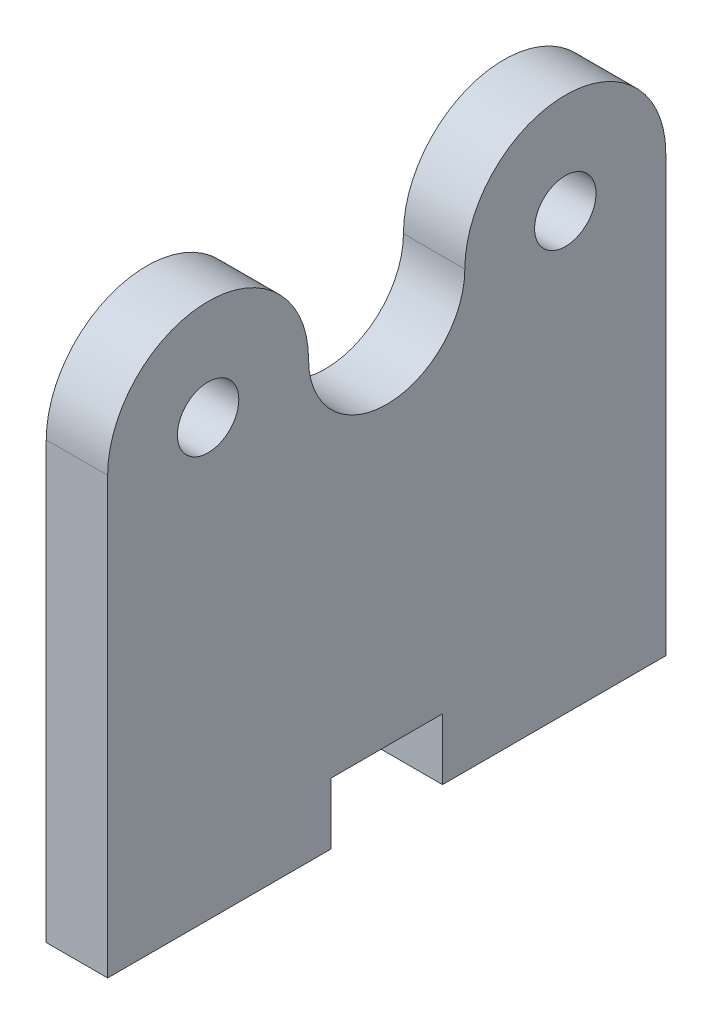
ISO-10303-21;
HEADER;
FILE_DESCRIPTION(('STEP AP214'),'2;1');
FILE_NAME('part.step','',(''),(''),'','','');
FILE_SCHEMA(('AUTOMOTIVE_DESIGN { 1 0 10303 214 1 1 1 1 }'));
ENDSEC;
DATA;
#1=APPLICATION_CONTEXT('core data for automotive mechanical design processes');
#2=APPLICATION_PROTOCOL_DEFINITION('international standard','automotive_design',2000,#1);
#3=PRODUCT_CONTEXT('',#1,'mechanical');
#4=PRODUCT('Part','Part','',(#3));
#5=PRODUCT_RELATED_PRODUCT_CATEGORY('part','',(#4));
#6=PRODUCT_DEFINITION_FORMATION('','',#4);
#7=PRODUCT_DEFINITION_CONTEXT('part definition',#1,'design');
#8=PRODUCT_DEFINITION('design','',#6,#7);
#9=PRODUCT_DEFINITION_SHAPE('','',#8);
#10=(LENGTH_UNIT() NAMED_UNIT(*) SI_UNIT(.MILLI.,.METRE.));
#11=(NAMED_UNIT(*) PLANE_ANGLE_UNIT() SI_UNIT($,.RADIAN.));
#12=(NAMED_UNIT(*) SI_UNIT($,.STERADIAN.) SOLID_ANGLE_UNIT());
#13=UNCERTAINTY_MEASURE_WITH_UNIT(LENGTH_MEASURE(1.E-05),#10,'distance_accuracy_value','');
#14=(GEOMETRIC_REPRESENTATION_CONTEXT(3) GLOBAL_UNCERTAINTY_ASSIGNED_CONTEXT((#13)) GLOBAL_UNIT_ASSIGNED_CONTEXT((#10,
#11,#12)) REPRESENTATION_CONTEXT('',''));
#15=CARTESIAN_POINT('',(0.,0.,0.));
#16=DIRECTION('',(0.,0.,1.));
#17=DIRECTION('',(1.,0.,0.));
#18=AXIS2_PLACEMENT_3D('',#15,#16,#17);
#19=CARTESIAN_POINT('',(5.5,0.,16.));
#20=DIRECTION('',(1.,0.,0.));
#21=DIRECTION('',(0.,0.,-1.));
#22=AXIS2_PLACEMENT_3D('',#19,#20,#21);
#23=PLANE('',#22);
#24=CARTESIAN_POINT('',(5.5,0.,16.));
#25=DIRECTION('',(1.,0.,0.));
#26=DIRECTION('',(0.,0.,-1.));
#27=AXIS2_PLACEMENT_3D('',#24,#25,#26);
#28=CIRCLE('',#27,2.75);
#29=CARTESIAN_POINT('',(5.5,0.,13.25));
#30=VERTEX_POINT('',#29);
#31=EDGE_CURVE('E143',#30,#30,#28,.T.);
#32=ORIENTED_EDGE('',*,*,#31,.F.);
#33=EDGE_LOOP('',(#32));
#34=FACE_BOUND('',#33,.T.);
#35=DIRECTION('',(0.,1.,0.));
#36=VECTOR('',#35,1.);
#37=CARTESIAN_POINT('',(5.5,-33.5,-25.));
#38=LINE('',#37,#36);
#39=CARTESIAN_POINT('',(5.5,-39.,-25.));
#40=VERTEX_POINT('',#39);
#41=CARTESIAN_POINT('',(5.5,0.,-25.));
#42=VERTEX_POINT('',#41);
#43=EDGE_CURVE('E97',#40,#42,#38,.T.);
#44=ORIENTED_EDGE('',*,*,#43,.T.);
#45=CARTESIAN_POINT('',(5.5,0.,-16.));
#46=DIRECTION('',(1.,0.,0.));
#47=DIRECTION('',(0.,0.,-1.));
#48=AXIS2_PLACEMENT_3D('',#45,#46,#47);
#49=CIRCLE('',#48,9.);
#50=CARTESIAN_POINT('',(5.5,0.,-7.));
#51=VERTEX_POINT('',#50);
#52=EDGE_CURVE('E206',#42,#51,#49,.T.);
#53=ORIENTED_EDGE('',*,*,#52,.T.);
#54=CARTESIAN_POINT('',(5.5,0.,0.));
#55=DIRECTION('',(-1.,0.,0.));
#56=DIRECTION('',(0.,0.,-1.));
#57=AXIS2_PLACEMENT_3D('',#54,#55,#56);
#58=CIRCLE('',#57,7.);
#59=CARTESIAN_POINT('',(5.5,0.,7.));
#60=VERTEX_POINT('',#59);
#61=EDGE_CURVE('E182',#51,#60,#58,.T.);
#62=ORIENTED_EDGE('',*,*,#61,.T.);
#63=CARTESIAN_POINT('',(5.5,0.,16.));
#64=DIRECTION('',(1.,0.,0.));
#65=DIRECTION('',(0.,0.,-1.));
#66=AXIS2_PLACEMENT_3D('',#63,#64,#65);
#67=CIRCLE('',#66,9.);
#68=CARTESIAN_POINT('',(5.5,0.,25.));
#69=VERTEX_POINT('',#68);
#70=EDGE_CURVE('E200',#60,#69,#67,.T.);
#71=ORIENTED_EDGE('',*,*,#70,.T.);
#72=DIRECTION('',(0.,-1.,0.));
#73=VECTOR('',#72,1.);
#74=CARTESIAN_POINT('',(5.5,0.,25.));
#75=LINE('',#74,#73);
#76=CARTESIAN_POINT('',(5.5,-39.,25.));
#77=VERTEX_POINT('',#76);
#78=EDGE_CURVE('E197',#69,#77,#75,.T.);
#79=ORIENTED_EDGE('',*,*,#78,.T.);
#80=DIRECTION('',(0.,0.,-1.));
#81=VECTOR('',#80,1.);
#82=CARTESIAN_POINT('',(5.5,-39.,25.));
#83=LINE('',#82,#81);
#84=CARTESIAN_POINT('',(5.5,-39.,5.));
#85=VERTEX_POINT('',#84);
#86=EDGE_CURVE('E199',#77,#85,#83,.T.);
#87=ORIENTED_EDGE('',*,*,#86,.T.);
#88=DIRECTION('',(0.,1.,0.));
#89=VECTOR('',#88,1.);
#90=CARTESIAN_POINT('',(5.5,-39.,5.));
#91=LINE('',#90,#89);
#92=CARTESIAN_POINT('',(5.5,-33.5,5.));
#93=VERTEX_POINT('',#92);
#94=EDGE_CURVE('E123',#85,#93,#91,.T.);
#95=ORIENTED_EDGE('',*,*,#94,.T.);
#96=DIRECTION('',(0.,0.,-1.));
#97=VECTOR('',#96,1.);
#98=CARTESIAN_POINT('',(5.5,-33.5,5.));
#99=LINE('',#98,#97);
#100=CARTESIAN_POINT('',(5.5,-33.5,-5.));
#101=VERTEX_POINT('',#100);
#102=EDGE_CURVE('E117',#93,#101,#99,.T.);
#103=ORIENTED_EDGE('',*,*,#102,.T.);
#104=DIRECTION('',(0.,-1.,0.));
#105=VECTOR('',#104,1.);
#106=CARTESIAN_POINT('',(5.5,-39.,-5.));
#107=LINE('',#106,#105);
#108=CARTESIAN_POINT('',(5.5,-39.,-5.));
#109=VERTEX_POINT('',#108);
#110=EDGE_CURVE('E121',#101,#109,#107,.T.);
#111=ORIENTED_EDGE('',*,*,#110,.T.);
#112=DIRECTION('',(0.,0.,-1.));
#113=VECTOR('',#112,1.);
#114=CARTESIAN_POINT('',(5.5,-39.,-25.));
#115=LINE('',#114,#113);
#116=EDGE_CURVE('E49',#109,#40,#115,.T.);
#117=ORIENTED_EDGE('',*,*,#116,.T.);
#118=EDGE_LOOP('',(#44,#53,#62,#71,#79,#87,#95,#103,#111,#117));
#119=FACE_BOUND('',#118,.T.);
#120=CARTESIAN_POINT('',(5.5,0.,-16.));
#121=DIRECTION('',(1.,0.,0.));
#122=DIRECTION('',(0.,0.,-1.));
#123=AXIS2_PLACEMENT_3D('',#120,#121,#122);
#124=CIRCLE('',#123,2.75);
#125=CARTESIAN_POINT('',(5.5,0.,-18.75));
#126=VERTEX_POINT('',#125);
#127=EDGE_CURVE('E212',#126,#126,#124,.T.);
#128=ORIENTED_EDGE('',*,*,#127,.F.);
#129=EDGE_LOOP('',(#128));
#130=FACE_BOUND('',#129,.T.);
#131=ADVANCED_FACE('F32',(#34,#119,#130),#23,.T.);
#132=CARTESIAN_POINT('',(0.,0.,16.));
#133=DIRECTION('',(1.,0.,0.));
#134=DIRECTION('',(0.,0.,-1.));
#135=AXIS2_PLACEMENT_3D('',#132,#133,#134);
#136=PLANE('',#135);
#137=DIRECTION('',(0.,1.,0.));
#138=VECTOR('',#137,1.);
#139=CARTESIAN_POINT('',(0.,-33.5,-25.));
#140=LINE('',#139,#138);
#141=CARTESIAN_POINT('',(0.,-39.,-25.));
#142=VERTEX_POINT('',#141);
#143=CARTESIAN_POINT('',(0.,0.,-25.));
#144=VERTEX_POINT('',#143);
#145=EDGE_CURVE('E91',#142,#144,#140,.T.);
#146=ORIENTED_EDGE('',*,*,#145,.F.);
#147=DIRECTION('',(0.,0.,-1.));
#148=VECTOR('',#147,1.);
#149=CARTESIAN_POINT('',(0.,-39.,-25.));
#150=LINE('',#149,#148);
#151=CARTESIAN_POINT('',(0.,-39.,-5.));
#152=VERTEX_POINT('',#151);
#153=EDGE_CURVE('E158',#152,#142,#150,.T.);
#154=ORIENTED_EDGE('',*,*,#153,.F.);
#155=DIRECTION('',(0.,-1.,0.));
#156=VECTOR('',#155,1.);
#157=CARTESIAN_POINT('',(0.,-39.,-5.));
#158=LINE('',#157,#156);
#159=CARTESIAN_POINT('',(0.,-33.5,-5.));
#160=VERTEX_POINT('',#159);
#161=EDGE_CURVE('E84',#160,#152,#158,.T.);
#162=ORIENTED_EDGE('',*,*,#161,.F.);
#163=DIRECTION('',(0.,0.,-1.));
#164=VECTOR('',#163,1.);
#165=CARTESIAN_POINT('',(0.,-33.5,5.));
#166=LINE('',#165,#164);
#167=CARTESIAN_POINT('',(0.,-33.5,5.));
#168=VERTEX_POINT('',#167);
#169=EDGE_CURVE('E131',#168,#160,#166,.T.);
#170=ORIENTED_EDGE('',*,*,#169,.F.);
#171=DIRECTION('',(0.,1.,0.));
#172=VECTOR('',#171,1.);
#173=CARTESIAN_POINT('',(0.,-39.,5.));
#174=LINE('',#173,#172);
#175=CARTESIAN_POINT('',(0.,-39.,5.));
#176=VERTEX_POINT('',#175);
#177=EDGE_CURVE('E154',#176,#168,#174,.T.);
#178=ORIENTED_EDGE('',*,*,#177,.F.);
#179=DIRECTION('',(0.,0.,-1.));
#180=VECTOR('',#179,1.);
#181=CARTESIAN_POINT('',(0.,-39.,25.));
#182=LINE('',#181,#180);
#183=CARTESIAN_POINT('',(0.,-39.,25.));
#184=VERTEX_POINT('',#183);
#185=EDGE_CURVE('E152',#184,#176,#182,.T.);
#186=ORIENTED_EDGE('',*,*,#185,.F.);
#187=DIRECTION('',(0.,-1.,0.));
#188=VECTOR('',#187,1.);
#189=CARTESIAN_POINT('',(0.,-33.5,25.));
#190=LINE('',#189,#188);
#191=CARTESIAN_POINT('',(0.,0.,25.));
#192=VERTEX_POINT('',#191);
#193=EDGE_CURVE('E150',#192,#184,#190,.T.);
#194=ORIENTED_EDGE('',*,*,#193,.F.);
#195=CARTESIAN_POINT('',(0.,0.,16.));
#196=DIRECTION('',(1.,0.,0.));
#197=DIRECTION('',(0.,0.,-1.));
#198=AXIS2_PLACEMENT_3D('',#195,#196,#197);
#199=CIRCLE('',#198,9.);
#200=CARTESIAN_POINT('',(0.,0.,7.));
#201=VERTEX_POINT('',#200);
#202=EDGE_CURVE('E147',#201,#192,#199,.T.);
#203=ORIENTED_EDGE('',*,*,#202,.F.);
#204=CARTESIAN_POINT('',(0.,0.,0.));
#205=DIRECTION('',(-1.,0.,0.));
#206=DIRECTION('',(0.,0.,-1.));
#207=AXIS2_PLACEMENT_3D('',#204,#205,#206);
#208=CIRCLE('',#207,7.);
#209=CARTESIAN_POINT('',(0.,0.,-7.));
#210=VERTEX_POINT('',#209);
#211=EDGE_CURVE('E145',#210,#201,#208,.T.);
#212=ORIENTED_EDGE('',*,*,#211,.F.);
#213=CARTESIAN_POINT('',(0.,0.,-16.));
#214=DIRECTION('',(1.,0.,0.));
#215=DIRECTION('',(0.,0.,-1.));
#216=AXIS2_PLACEMENT_3D('',#213,#214,#215);
#217=CIRCLE('',#216,9.);
#218=EDGE_CURVE('E142',#144,#210,#217,.T.);
#219=ORIENTED_EDGE('',*,*,#218,.F.);
#220=EDGE_LOOP('',(#146,#154,#162,#170,#178,#186,#194,#203,#212,#219));
#221=FACE_BOUND('',#220,.T.);
#222=CARTESIAN_POINT('',(0.,0.,16.));
#223=DIRECTION('',(1.,0.,0.));
#224=DIRECTION('',(0.,0.,-1.));
#225=AXIS2_PLACEMENT_3D('',#222,#223,#224);
#226=CIRCLE('',#225,2.75);
#227=CARTESIAN_POINT('',(0.,0.,13.25));
#228=VERTEX_POINT('',#227);
#229=EDGE_CURVE('E209',#228,#228,#226,.T.);
#230=ORIENTED_EDGE('',*,*,#229,.T.);
#231=EDGE_LOOP('',(#230));
#232=FACE_BOUND('',#231,.T.);
#233=CARTESIAN_POINT('',(0.,0.,-16.));
#234=DIRECTION('',(1.,0.,0.));
#235=DIRECTION('',(0.,0.,-1.));
#236=AXIS2_PLACEMENT_3D('',#233,#234,#235);
#237=CIRCLE('',#236,2.75);
#238=CARTESIAN_POINT('',(0.,0.,-18.75));
#239=VERTEX_POINT('',#238);
#240=EDGE_CURVE('E215',#239,#239,#237,.T.);
#241=ORIENTED_EDGE('',*,*,#240,.T.);
#242=EDGE_LOOP('',(#241));
#243=FACE_BOUND('',#242,.T.);
#244=ADVANCED_FACE('F186',(#221,#232,#243),#136,.F.);
#245=CARTESIAN_POINT('',(5.5,-33.5,-25.));
#246=DIRECTION('',(0.,0.,1.));
#247=DIRECTION('',(0.,-1.,0.));
#248=AXIS2_PLACEMENT_3D('',#245,#246,#247);
#249=PLANE('',#248);
#250=ORIENTED_EDGE('',*,*,#145,.T.);
#251=DIRECTION('',(-1.,0.,0.));
#252=VECTOR('',#251,1.);
#253=CARTESIAN_POINT('',(5.5,0.,-25.));
#254=LINE('',#253,#252);
#255=EDGE_CURVE('E11',#42,#144,#254,.T.);
#256=ORIENTED_EDGE('',*,*,#255,.F.);
#257=ORIENTED_EDGE('',*,*,#43,.F.);
#258=DIRECTION('',(-1.,0.,0.));
#259=VECTOR('',#258,1.);
#260=CARTESIAN_POINT('',(5.5,-39.,-25.));
#261=LINE('',#260,#259);
#262=EDGE_CURVE('E137',#40,#142,#261,.T.);
#263=ORIENTED_EDGE('',*,*,#262,.T.);
#264=EDGE_LOOP('',(#250,#256,#257,#263));
#265=FACE_BOUND('',#264,.T.);
#266=ADVANCED_FACE('F34',(#265),#249,.F.);
#267=CARTESIAN_POINT('',(5.5,0.,-16.));
#268=DIRECTION('',(-1.,0.,0.));
#269=DIRECTION('',(0.,0.,1.));
#270=AXIS2_PLACEMENT_3D('',#267,#268,#269);
#271=CYLINDRICAL_SURFACE('',#270,9.);
#272=ORIENTED_EDGE('',*,*,#218,.T.);
#273=DIRECTION('',(-1.,0.,0.));
#274=VECTOR('',#273,1.);
#275=CARTESIAN_POINT('',(5.5,0.,-7.));
#276=LINE('',#275,#274);
#277=EDGE_CURVE('E41',#51,#210,#276,.T.);
#278=ORIENTED_EDGE('',*,*,#277,.F.);
#279=ORIENTED_EDGE('',*,*,#52,.F.);
#280=ORIENTED_EDGE('',*,*,#255,.T.);
#281=EDGE_LOOP('',(#272,#278,#279,#280));
#282=FACE_BOUND('',#281,.T.);
#283=ADVANCED_FACE('F256',(#282),#271,.T.);
#284=CARTESIAN_POINT('',(5.5,0.,0.));
#285=DIRECTION('',(-1.,0.,0.));
#286=DIRECTION('',(0.,0.,1.));
#287=AXIS2_PLACEMENT_3D('',#284,#285,#286);
#288=CYLINDRICAL_SURFACE('',#287,7.);
#289=ORIENTED_EDGE('',*,*,#211,.T.);
#290=DIRECTION('',(-1.,0.,0.));
#291=VECTOR('',#290,1.);
#292=CARTESIAN_POINT('',(5.5,0.,7.));
#293=LINE('',#292,#291);
#294=EDGE_CURVE('E173',#60,#201,#293,.T.);
#295=ORIENTED_EDGE('',*,*,#294,.F.);
#296=ORIENTED_EDGE('',*,*,#61,.F.);
#297=ORIENTED_EDGE('',*,*,#277,.T.);
#298=EDGE_LOOP('',(#289,#295,#296,#297));
#299=FACE_BOUND('',#298,.T.);
#300=ADVANCED_FACE('F180',(#299),#288,.F.);
#301=CARTESIAN_POINT('',(5.5,0.,16.));
#302=DIRECTION('',(-1.,0.,0.));
#303=DIRECTION('',(0.,0.,1.));
#304=AXIS2_PLACEMENT_3D('',#301,#302,#303);
#305=CYLINDRICAL_SURFACE('',#304,9.);
#306=ORIENTED_EDGE('',*,*,#202,.T.);
#307=DIRECTION('',(-1.,0.,0.));
#308=VECTOR('',#307,1.);
#309=CARTESIAN_POINT('',(5.5,0.,25.));
#310=LINE('',#309,#308);
#311=EDGE_CURVE('E170',#69,#192,#310,.T.);
#312=ORIENTED_EDGE('',*,*,#311,.F.);
#313=ORIENTED_EDGE('',*,*,#70,.F.);
#314=ORIENTED_EDGE('',*,*,#294,.T.);
#315=EDGE_LOOP('',(#306,#312,#313,#314));
#316=FACE_BOUND('',#315,.T.);
#317=ADVANCED_FACE('F191',(#316),#305,.T.);
#318=CARTESIAN_POINT('',(5.5,-33.5,25.));
#319=DIRECTION('',(0.,0.,-1.));
#320=DIRECTION('',(-1.,0.,0.));
#321=AXIS2_PLACEMENT_3D('',#318,#319,#320);
#322=PLANE('',#321);
#323=ORIENTED_EDGE('',*,*,#193,.T.);
#324=DIRECTION('',(-1.,0.,0.));
#325=VECTOR('',#324,1.);
#326=CARTESIAN_POINT('',(5.5,-39.,25.));
#327=LINE('',#326,#325);
#328=EDGE_CURVE('E167',#77,#184,#327,.T.);
#329=ORIENTED_EDGE('',*,*,#328,.F.);
#330=ORIENTED_EDGE('',*,*,#78,.F.);
#331=ORIENTED_EDGE('',*,*,#311,.T.);
#332=EDGE_LOOP('',(#323,#329,#330,#331));
#333=FACE_BOUND('',#332,.T.);
#334=ADVANCED_FACE('F195',(#333),#322,.F.);
#335=CARTESIAN_POINT('',(5.5,-39.,25.));
#336=DIRECTION('',(0.,1.,0.));
#337=DIRECTION('',(0.,0.,1.));
#338=AXIS2_PLACEMENT_3D('',#335,#336,#337);
#339=PLANE('',#338);
#340=ORIENTED_EDGE('',*,*,#185,.T.);
#341=DIRECTION('',(-1.,0.,0.));
#342=VECTOR('',#341,1.);
#343=CARTESIAN_POINT('',(5.5,-39.,5.));
#344=LINE('',#343,#342);
#345=EDGE_CURVE('E164',#85,#176,#344,.T.);
#346=ORIENTED_EDGE('',*,*,#345,.F.);
#347=ORIENTED_EDGE('',*,*,#86,.F.);
#348=ORIENTED_EDGE('',*,*,#328,.T.);
#349=EDGE_LOOP('',(#340,#346,#347,#348));
#350=FACE_BOUND('',#349,.T.);
#351=ADVANCED_FACE('F246',(#350),#339,.F.);
#352=CARTESIAN_POINT('',(5.5,-39.,5.));
#353=DIRECTION('',(0.,0.,1.));
#354=DIRECTION('',(1.,0.,0.));
#355=AXIS2_PLACEMENT_3D('',#352,#353,#354);
#356=PLANE('',#355);
#357=ORIENTED_EDGE('',*,*,#177,.T.);
#358=DIRECTION('',(-1.,0.,0.));
#359=VECTOR('',#358,1.);
#360=CARTESIAN_POINT('',(5.5,-33.5,5.));
#361=LINE('',#360,#359);
#362=EDGE_CURVE('E132',#93,#168,#361,.T.);
#363=ORIENTED_EDGE('',*,*,#362,.F.);
#364=ORIENTED_EDGE('',*,*,#94,.F.);
#365=ORIENTED_EDGE('',*,*,#345,.T.);
#366=EDGE_LOOP('',(#357,#363,#364,#365));
#367=FACE_BOUND('',#366,.T.);
#368=ADVANCED_FACE('F243',(#367),#356,.F.);
#369=CARTESIAN_POINT('',(5.5,-33.5,5.));
#370=DIRECTION('',(0.,1.,0.));
#371=DIRECTION('',(0.,0.,1.));
#372=AXIS2_PLACEMENT_3D('',#369,#370,#371);
#373=PLANE('',#372);
#374=ORIENTED_EDGE('',*,*,#169,.T.);
#375=DIRECTION('',(-1.,0.,0.));
#376=VECTOR('',#375,1.);
#377=CARTESIAN_POINT('',(5.5,-33.5,-5.));
#378=LINE('',#377,#376);
#379=EDGE_CURVE('E128',#101,#160,#378,.T.);
#380=ORIENTED_EDGE('',*,*,#379,.F.);
#381=ORIENTED_EDGE('',*,*,#102,.F.);
#382=ORIENTED_EDGE('',*,*,#362,.T.);
#383=EDGE_LOOP('',(#374,#380,#381,#382));
#384=FACE_BOUND('',#383,.T.);
#385=ADVANCED_FACE('F129',(#384),#373,.F.);
#386=CARTESIAN_POINT('',(5.5,-39.,-5.));
#387=DIRECTION('',(0.,0.,-1.));
#388=DIRECTION('',(-1.,0.,0.));
#389=AXIS2_PLACEMENT_3D('',#386,#387,#388);
#390=PLANE('',#389);
#391=ORIENTED_EDGE('',*,*,#161,.T.);
#392=DIRECTION('',(-1.,0.,0.));
#393=VECTOR('',#392,1.);
#394=CARTESIAN_POINT('',(5.5,-39.,-5.));
#395=LINE('',#394,#393);
#396=EDGE_CURVE('E133',#109,#152,#395,.T.);
#397=ORIENTED_EDGE('',*,*,#396,.F.);
#398=ORIENTED_EDGE('',*,*,#110,.F.);
#399=ORIENTED_EDGE('',*,*,#379,.T.);
#400=EDGE_LOOP('',(#391,#397,#398,#399));
#401=FACE_BOUND('',#400,.T.);
#402=ADVANCED_FACE('F135',(#401),#390,.F.);
#403=CARTESIAN_POINT('',(5.5,-39.,-25.));
#404=DIRECTION('',(0.,1.,0.));
#405=DIRECTION('',(0.,0.,1.));
#406=AXIS2_PLACEMENT_3D('',#403,#404,#405);
#407=PLANE('',#406);
#408=ORIENTED_EDGE('',*,*,#153,.T.);
#409=ORIENTED_EDGE('',*,*,#262,.F.);
#410=ORIENTED_EDGE('',*,*,#116,.F.);
#411=ORIENTED_EDGE('',*,*,#396,.T.);
#412=EDGE_LOOP('',(#408,#409,#410,#411));
#413=FACE_BOUND('',#412,.T.);
#414=ADVANCED_FACE('F235',(#413),#407,.F.);
#415=CARTESIAN_POINT('',(5.5,0.,16.));
#416=DIRECTION('',(-1.,0.,0.));
#417=DIRECTION('',(0.,0.,1.));
#418=AXIS2_PLACEMENT_3D('',#415,#416,#417);
#419=CYLINDRICAL_SURFACE('',#418,2.75);
#420=ORIENTED_EDGE('',*,*,#31,.T.);
#421=EDGE_LOOP('',(#420));
#422=FACE_BOUND('',#421,.T.);
#423=ORIENTED_EDGE('',*,*,#229,.F.);
#424=EDGE_LOOP('',(#423));
#425=FACE_BOUND('',#424,.T.);
#426=ADVANCED_FACE('F232',(#422,#425),#419,.F.);
#427=CARTESIAN_POINT('',(5.5,0.,-16.));
#428=DIRECTION('',(-1.,0.,0.));
#429=DIRECTION('',(0.,0.,1.));
#430=AXIS2_PLACEMENT_3D('',#427,#428,#429);
#431=CYLINDRICAL_SURFACE('',#430,2.75);
#432=ORIENTED_EDGE('',*,*,#127,.T.);
#433=EDGE_LOOP('',(#432));
#434=FACE_BOUND('',#433,.T.);
#435=ORIENTED_EDGE('',*,*,#240,.F.);
#436=EDGE_LOOP('',(#435));
#437=FACE_BOUND('',#436,.T.);
#438=ADVANCED_FACE('F221',(#434,#437),#431,.F.);
#439=CLOSED_SHELL('',(#131,#244,#266,#283,#300,#317,#334,#351,#368,#385,#402,#414,#426,#438));
#440=MANIFOLD_SOLID_BREP('B2',#439);
#441=ADVANCED_BREP_SHAPE_REPRESENTATION('',(#18,#440),#14);
#442=SHAPE_DEFINITION_REPRESENTATION(#9,#441);
ENDSEC;
END-ISO-10303-21;
